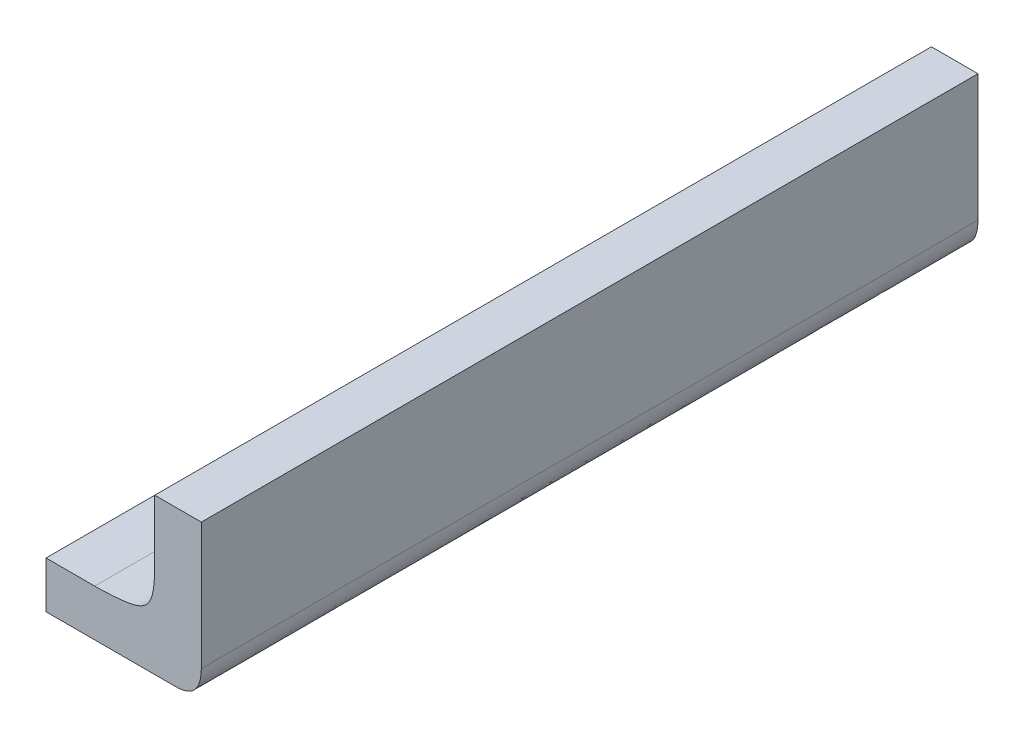
ISO-10303-21;
HEADER;
FILE_DESCRIPTION(('STEP AP214'),'2;1');
FILE_NAME('part.step','',(''),(''),'','','');
FILE_SCHEMA(('AUTOMOTIVE_DESIGN { 1 0 10303 214 1 1 1 1 }'));
ENDSEC;
DATA;
#1=APPLICATION_CONTEXT('core data for automotive mechanical design processes');
#2=APPLICATION_PROTOCOL_DEFINITION('international standard','automotive_design',2000,#1);
#3=PRODUCT_CONTEXT('',#1,'mechanical');
#4=PRODUCT('Part','Part','',(#3));
#5=PRODUCT_RELATED_PRODUCT_CATEGORY('part','',(#4));
#6=PRODUCT_DEFINITION_FORMATION('','',#4);
#7=PRODUCT_DEFINITION_CONTEXT('part definition',#1,'design');
#8=PRODUCT_DEFINITION('design','',#6,#7);
#9=PRODUCT_DEFINITION_SHAPE('','',#8);
#10=(LENGTH_UNIT() NAMED_UNIT(*) SI_UNIT(.MILLI.,.METRE.));
#11=(NAMED_UNIT(*) PLANE_ANGLE_UNIT() SI_UNIT($,.RADIAN.));
#12=(NAMED_UNIT(*) SI_UNIT($,.STERADIAN.) SOLID_ANGLE_UNIT());
#13=UNCERTAINTY_MEASURE_WITH_UNIT(LENGTH_MEASURE(1.E-05),#10,'distance_accuracy_value','');
#14=(GEOMETRIC_REPRESENTATION_CONTEXT(3) GLOBAL_UNCERTAINTY_ASSIGNED_CONTEXT((#13)) GLOBAL_UNIT_ASSIGNED_CONTEXT((#10,
#11,#12)) REPRESENTATION_CONTEXT('',''));
#15=CARTESIAN_POINT('',(0.,0.,0.));
#16=DIRECTION('',(0.,0.,1.));
#17=DIRECTION('',(1.,0.,0.));
#18=AXIS2_PLACEMENT_3D('',#15,#16,#17);
#19=CARTESIAN_POINT('',(8.00000000000001,-26.5516886047209,50.));
#20=CARTESIAN_POINT('',(8.00904035980221,-28.4144851445603,50.));
#21=CARTESIAN_POINT('',(6.3752193252884,-28.4285714285714,50.));
#22=B_SPLINE_CURVE_WITH_KNOTS('',2,(#19,#20,#21),.UNSPECIFIED.,.F.,.F.,(3,3),(0.,1.),.UNSPECIFIED.);
#23=DIRECTION('',(0.,0.,-1.));
#24=VECTOR('',#23,1.);
#25=SURFACE_OF_LINEAR_EXTRUSION('',#22,#24);
#26=CARTESIAN_POINT('',(8.00000000000001,-26.5516886047209,0.));
#27=CARTESIAN_POINT('',(8.00904035980221,-28.4144851445603,0.));
#28=CARTESIAN_POINT('',(6.3752193252884,-28.4285714285714,0.));
#29=B_SPLINE_CURVE_WITH_KNOTS('',2,(#26,#27,#28),.UNSPECIFIED.,.F.,.F.,(3,3),(0.,1.),.UNSPECIFIED.);
#30=CARTESIAN_POINT('',(8.00000000000001,-26.5924635483083,0.));
#31=VERTEX_POINT('',#30);
#32=CARTESIAN_POINT('',(6.3752193252884,-28.4285714285714,0.));
#33=VERTEX_POINT('',#32);
#34=EDGE_CURVE('E129',#31,#33,#29,.T.);
#35=ORIENTED_EDGE('',*,*,#34,.F.);
#36=DIRECTION('',(0.,0.,-1.));
#37=VECTOR('',#36,1.);
#38=CARTESIAN_POINT('',(8.00000000000001,-26.5924635483083,50.));
#39=LINE('',#38,#37);
#40=CARTESIAN_POINT('',(8.00000000000001,-26.5924635483083,50.));
#41=VERTEX_POINT('',#40);
#42=EDGE_CURVE('E11',#41,#31,#39,.T.);
#43=ORIENTED_EDGE('',*,*,#42,.F.);
#44=CARTESIAN_POINT('',(6.3752193252884,-28.4285714285714,50.));
#45=VERTEX_POINT('',#44);
#46=EDGE_CURVE('E159',#41,#45,#22,.T.);
#47=ORIENTED_EDGE('',*,*,#46,.T.);
#48=DIRECTION('',(0.,0.,-1.));
#49=VECTOR('',#48,1.);
#50=CARTESIAN_POINT('',(6.3752193252884,-28.4285714285714,50.));
#51=LINE('',#50,#49);
#52=EDGE_CURVE('E86',#45,#33,#51,.T.);
#53=ORIENTED_EDGE('',*,*,#52,.T.);
#54=EDGE_LOOP('',(#35,#43,#47,#53));
#55=FACE_BOUND('',#54,.T.);
#56=ADVANCED_FACE('F35',(#55),#25,.T.);
#57=CARTESIAN_POINT('',(8.00000000000001,0.,50.));
#58=DIRECTION('',(1.,0.,0.));
#59=DIRECTION('',(0.,1.,0.));
#60=AXIS2_PLACEMENT_3D('',#57,#58,#59);
#61=PLANE('',#60);
#62=DIRECTION('',(0.,-1.,0.));
#63=VECTOR('',#62,1.);
#64=CARTESIAN_POINT('',(8.00000000000001,0.,0.));
#65=LINE('',#64,#63);
#66=CARTESIAN_POINT('',(8.00000000000001,-18.4285714285714,0.));
#67=VERTEX_POINT('',#66);
#68=EDGE_CURVE('E134',#67,#31,#65,.T.);
#69=ORIENTED_EDGE('',*,*,#68,.F.);
#70=DIRECTION('',(0.,0.,-1.));
#71=VECTOR('',#70,1.);
#72=CARTESIAN_POINT('',(8.00000000000001,-18.4285714285714,50.));
#73=LINE('',#72,#71);
#74=CARTESIAN_POINT('',(8.00000000000001,-18.4285714285714,50.));
#75=VERTEX_POINT('',#74);
#76=EDGE_CURVE('E44',#75,#67,#73,.T.);
#77=ORIENTED_EDGE('',*,*,#76,.F.);
#78=DIRECTION('',(0.,-1.,0.));
#79=VECTOR('',#78,1.);
#80=CARTESIAN_POINT('',(8.00000000000001,0.,50.));
#81=LINE('',#80,#79);
#82=EDGE_CURVE('E181',#75,#41,#81,.T.);
#83=ORIENTED_EDGE('',*,*,#82,.T.);
#84=ORIENTED_EDGE('',*,*,#42,.T.);
#85=EDGE_LOOP('',(#69,#77,#83,#84));
#86=FACE_BOUND('',#85,.T.);
#87=ADVANCED_FACE('F180',(#86),#61,.T.);
#88=CARTESIAN_POINT('',(0.,-18.4285714285714,50.));
#89=DIRECTION('',(0.,-1.,0.));
#90=DIRECTION('',(0.,0.,-1.));
#91=AXIS2_PLACEMENT_3D('',#88,#89,#90);
#92=PLANE('',#91);
#93=DIRECTION('',(-1.,0.,0.));
#94=VECTOR('',#93,1.);
#95=CARTESIAN_POINT('',(0.,-18.4285714285714,0.));
#96=LINE('',#95,#94);
#97=CARTESIAN_POINT('',(5.00000000000001,-18.4285714285714,0.));
#98=VERTEX_POINT('',#97);
#99=EDGE_CURVE('E140',#67,#98,#96,.T.);
#100=ORIENTED_EDGE('',*,*,#99,.T.);
#101=DIRECTION('',(0.,0.,-1.));
#102=VECTOR('',#101,1.);
#103=CARTESIAN_POINT('',(5.00000000000001,-18.4285714285714,50.));
#104=LINE('',#103,#102);
#105=CARTESIAN_POINT('',(5.00000000000001,-18.4285714285714,50.));
#106=VERTEX_POINT('',#105);
#107=EDGE_CURVE('E165',#106,#98,#104,.T.);
#108=ORIENTED_EDGE('',*,*,#107,.F.);
#109=DIRECTION('',(-1.,0.,0.));
#110=VECTOR('',#109,1.);
#111=CARTESIAN_POINT('',(0.,-18.4285714285714,50.));
#112=LINE('',#111,#110);
#113=EDGE_CURVE('E171',#75,#106,#112,.T.);
#114=ORIENTED_EDGE('',*,*,#113,.F.);
#115=ORIENTED_EDGE('',*,*,#76,.T.);
#116=EDGE_LOOP('',(#100,#108,#114,#115));
#117=FACE_BOUND('',#116,.T.);
#118=ADVANCED_FACE('F169',(#117),#92,.F.);
#119=CARTESIAN_POINT('',(5.00000000000001,0.,50.));
#120=DIRECTION('',(-1.,0.,0.));
#121=DIRECTION('',(0.,0.,1.));
#122=AXIS2_PLACEMENT_3D('',#119,#120,#121);
#123=PLANE('',#122);
#124=DIRECTION('',(0.,1.,0.));
#125=VECTOR('',#124,1.);
#126=CARTESIAN_POINT('',(5.00000000000001,0.,0.));
#127=LINE('',#126,#125);
#128=CARTESIAN_POINT('',(5.00000000000001,-21.9285714285714,0.));
#129=VERTEX_POINT('',#128);
#130=EDGE_CURVE('E143',#129,#98,#127,.T.);
#131=ORIENTED_EDGE('',*,*,#130,.F.);
#132=DIRECTION('',(0.,0.,-1.));
#133=VECTOR('',#132,1.);
#134=CARTESIAN_POINT('',(5.00000000000001,-21.9285714285714,50.));
#135=LINE('',#134,#133);
#136=CARTESIAN_POINT('',(5.00000000000001,-21.9285714285714,50.));
#137=VERTEX_POINT('',#136);
#138=EDGE_CURVE('E163',#137,#129,#135,.T.);
#139=ORIENTED_EDGE('',*,*,#138,.F.);
#140=DIRECTION('',(0.,1.,0.));
#141=VECTOR('',#140,1.);
#142=CARTESIAN_POINT('',(5.00000000000001,0.,50.));
#143=LINE('',#142,#141);
#144=EDGE_CURVE('E192',#137,#106,#143,.T.);
#145=ORIENTED_EDGE('',*,*,#144,.T.);
#146=ORIENTED_EDGE('',*,*,#107,.T.);
#147=EDGE_LOOP('',(#131,#139,#145,#146));
#148=FACE_BOUND('',#147,.T.);
#149=ADVANCED_FACE('F205',(#148),#123,.T.);
#150=CARTESIAN_POINT('',(5.00000000000001,-21.9285714285714,50.));
#151=CARTESIAN_POINT('',(5.02475860111306,-24.8319786522231,50.));
#152=CARTESIAN_POINT('',(4.6481648589299,-25.25803559208,50.));
#153=CARTESIAN_POINT('',(1.64350872179383,-25.429885021835,50.));
#154=CARTESIAN_POINT('',(1.24618397990168,-25.4322017250564,50.));
#155=CARTESIAN_POINT('',(1.13540823861354,-25.4285714285714,50.));
#156=B_SPLINE_CURVE_WITH_KNOTS('',3,(#150,#151,#152,#153,#154,#155),.UNSPECIFIED.,.F.,.F.,(4,1,
1,4),(0.,0.274480378204325,0.306299738792352,0.31819360588027),.UNSPECIFIED.);
#157=DIRECTION('',(0.,0.,-1.));
#158=VECTOR('',#157,1.);
#159=SURFACE_OF_LINEAR_EXTRUSION('',#156,#158);
#160=CARTESIAN_POINT('',(5.00000000000001,-21.9285714285714,0.));
#161=CARTESIAN_POINT('',(5.02475860111306,-24.8319786522231,0.));
#162=CARTESIAN_POINT('',(4.6481648589299,-25.25803559208,0.));
#163=CARTESIAN_POINT('',(1.64350872179383,-25.429885021835,0.));
#164=CARTESIAN_POINT('',(1.24618397990168,-25.4322017250564,0.));
#165=CARTESIAN_POINT('',(1.13540823861354,-25.4285714285714,0.));
#166=B_SPLINE_CURVE_WITH_KNOTS('',3,(#160,#161,#162,#163,#164,#165),.UNSPECIFIED.,.F.,.F.,(4,1,
1,4),(0.,0.274480378204325,0.306299738792352,0.31819360588027),.UNSPECIFIED.);
#167=CARTESIAN_POINT('',(1.13540823861354,-25.4285714285714,0.));
#168=VERTEX_POINT('',#167);
#169=EDGE_CURVE('E146',#129,#168,#166,.T.);
#170=ORIENTED_EDGE('',*,*,#169,.T.);
#171=DIRECTION('',(0.,0.,-1.));
#172=VECTOR('',#171,1.);
#173=CARTESIAN_POINT('',(1.13540823861354,-25.4285714285714,50.));
#174=LINE('',#173,#172);
#175=CARTESIAN_POINT('',(1.13540823861354,-25.4285714285714,50.));
#176=VERTEX_POINT('',#175);
#177=EDGE_CURVE('E115',#176,#168,#174,.T.);
#178=ORIENTED_EDGE('',*,*,#177,.F.);
#179=EDGE_CURVE('E121',#137,#176,#156,.T.);
#180=ORIENTED_EDGE('',*,*,#179,.F.);
#181=ORIENTED_EDGE('',*,*,#138,.T.);
#182=EDGE_LOOP('',(#170,#178,#180,#181));
#183=FACE_BOUND('',#182,.T.);
#184=ADVANCED_FACE('F201',(#183),#159,.F.);
#185=CARTESIAN_POINT('',(3.27685724359909E-13,-25.4285714285714,50.));
#186=DIRECTION('',(0.,1.,0.));
#187=DIRECTION('',(-1.,0.,0.));
#188=AXIS2_PLACEMENT_3D('',#185,#186,#187);
#189=PLANE('',#188);
#190=DIRECTION('',(1.,0.,0.));
#191=VECTOR('',#190,1.);
#192=CARTESIAN_POINT('',(3.27685724359909E-13,-25.4285714285714,0.));
#193=LINE('',#192,#191);
#194=CARTESIAN_POINT('',(-1.99999999999999,-25.4285714285714,0.));
#195=VERTEX_POINT('',#194);
#196=EDGE_CURVE('E110',#195,#168,#193,.T.);
#197=ORIENTED_EDGE('',*,*,#196,.F.);
#198=DIRECTION('',(0.,0.,-1.));
#199=VECTOR('',#198,1.);
#200=CARTESIAN_POINT('',(-1.99999999999999,-25.4285714285714,50.));
#201=LINE('',#200,#199);
#202=CARTESIAN_POINT('',(-1.99999999999999,-25.4285714285714,50.));
#203=VERTEX_POINT('',#202);
#204=EDGE_CURVE('E105',#203,#195,#201,.T.);
#205=ORIENTED_EDGE('',*,*,#204,.F.);
#206=DIRECTION('',(1.,0.,0.));
#207=VECTOR('',#206,1.);
#208=CARTESIAN_POINT('',(3.27685724359909E-13,-25.4285714285714,50.));
#209=LINE('',#208,#207);
#210=EDGE_CURVE('E108',#203,#176,#209,.T.);
#211=ORIENTED_EDGE('',*,*,#210,.T.);
#212=ORIENTED_EDGE('',*,*,#177,.T.);
#213=EDGE_LOOP('',(#197,#205,#211,#212));
#214=FACE_BOUND('',#213,.T.);
#215=ADVANCED_FACE('F107',(#214),#189,.T.);
#216=CARTESIAN_POINT('',(-1.99999999999999,0.,50.));
#217=DIRECTION('',(-1.,0.,0.));
#218=DIRECTION('',(0.,0.,1.));
#219=AXIS2_PLACEMENT_3D('',#216,#217,#218);
#220=PLANE('',#219);
#221=DIRECTION('',(0.,1.,0.));
#222=VECTOR('',#221,1.);
#223=CARTESIAN_POINT('',(-1.99999999999999,0.,0.));
#224=LINE('',#223,#222);
#225=CARTESIAN_POINT('',(-1.99999999999999,-28.4285714285714,0.));
#226=VERTEX_POINT('',#225);
#227=EDGE_CURVE('E155',#226,#195,#224,.T.);
#228=ORIENTED_EDGE('',*,*,#227,.F.);
#229=DIRECTION('',(0.,0.,-1.));
#230=VECTOR('',#229,1.);
#231=CARTESIAN_POINT('',(-1.99999999999999,-28.4285714285714,50.));
#232=LINE('',#231,#230);
#233=CARTESIAN_POINT('',(-1.99999999999999,-28.4285714285714,50.));
#234=VERTEX_POINT('',#233);
#235=EDGE_CURVE('E79',#234,#226,#232,.T.);
#236=ORIENTED_EDGE('',*,*,#235,.F.);
#237=DIRECTION('',(0.,1.,0.));
#238=VECTOR('',#237,1.);
#239=CARTESIAN_POINT('',(-1.99999999999999,0.,50.));
#240=LINE('',#239,#238);
#241=EDGE_CURVE('E118',#234,#203,#240,.T.);
#242=ORIENTED_EDGE('',*,*,#241,.T.);
#243=ORIENTED_EDGE('',*,*,#204,.T.);
#244=EDGE_LOOP('',(#228,#236,#242,#243));
#245=FACE_BOUND('',#244,.T.);
#246=ADVANCED_FACE('F124',(#245),#220,.T.);
#247=CARTESIAN_POINT('',(0.,-28.4285714285714,50.));
#248=DIRECTION('',(0.,1.,0.));
#249=DIRECTION('',(0.,0.,1.));
#250=AXIS2_PLACEMENT_3D('',#247,#248,#249);
#251=PLANE('',#250);
#252=DIRECTION('',(1.,0.,0.));
#253=VECTOR('',#252,1.);
#254=CARTESIAN_POINT('',(0.,-28.4285714285714,0.));
#255=LINE('',#254,#253);
#256=EDGE_CURVE('E157',#226,#33,#255,.T.);
#257=ORIENTED_EDGE('',*,*,#256,.T.);
#258=ORIENTED_EDGE('',*,*,#52,.F.);
#259=DIRECTION('',(1.,0.,0.));
#260=VECTOR('',#259,1.);
#261=CARTESIAN_POINT('',(0.,-28.4285714285714,50.));
#262=LINE('',#261,#260);
#263=EDGE_CURVE('E52',#234,#45,#262,.T.);
#264=ORIENTED_EDGE('',*,*,#263,.F.);
#265=ORIENTED_EDGE('',*,*,#235,.T.);
#266=EDGE_LOOP('',(#257,#258,#264,#265));
#267=FACE_BOUND('',#266,.T.);
#268=ADVANCED_FACE('F182',(#267),#251,.F.);
#269=CARTESIAN_POINT('',(0.,0.,50.));
#270=DIRECTION('',(0.,0.,1.));
#271=DIRECTION('',(1.,0.,0.));
#272=AXIS2_PLACEMENT_3D('',#269,#270,#271);
#273=PLANE('',#272);
#274=ORIENTED_EDGE('',*,*,#46,.F.);
#275=ORIENTED_EDGE('',*,*,#82,.F.);
#276=ORIENTED_EDGE('',*,*,#113,.T.);
#277=ORIENTED_EDGE('',*,*,#144,.F.);
#278=ORIENTED_EDGE('',*,*,#179,.T.);
#279=ORIENTED_EDGE('',*,*,#210,.F.);
#280=ORIENTED_EDGE('',*,*,#241,.F.);
#281=ORIENTED_EDGE('',*,*,#263,.T.);
#282=EDGE_LOOP('',(#274,#275,#276,#277,#278,#279,#280,#281));
#283=FACE_BOUND('',#282,.T.);
#284=ADVANCED_FACE('F117',(#283),#273,.T.);
#285=CARTESIAN_POINT('',(0.,0.,0.));
#286=DIRECTION('',(0.,0.,1.));
#287=DIRECTION('',(1.,0.,0.));
#288=AXIS2_PLACEMENT_3D('',#285,#286,#287);
#289=PLANE('',#288);
#290=ORIENTED_EDGE('',*,*,#34,.T.);
#291=ORIENTED_EDGE('',*,*,#256,.F.);
#292=ORIENTED_EDGE('',*,*,#227,.T.);
#293=ORIENTED_EDGE('',*,*,#196,.T.);
#294=ORIENTED_EDGE('',*,*,#169,.F.);
#295=ORIENTED_EDGE('',*,*,#130,.T.);
#296=ORIENTED_EDGE('',*,*,#99,.F.);
#297=ORIENTED_EDGE('',*,*,#68,.T.);
#298=EDGE_LOOP('',(#290,#291,#292,#293,#294,#295,#296,#297));
#299=FACE_BOUND('',#298,.T.);
#300=ADVANCED_FACE('F177',(#299),#289,.F.);
#301=CLOSED_SHELL('',(#56,#87,#118,#149,#184,#215,#246,#268,#284,#300));
#302=MANIFOLD_SOLID_BREP('B2',#301);
#303=ADVANCED_BREP_SHAPE_REPRESENTATION('',(#18,#302),#14);
#304=SHAPE_DEFINITION_REPRESENTATION(#9,#303);
ENDSEC;
END-ISO-10303-21;
